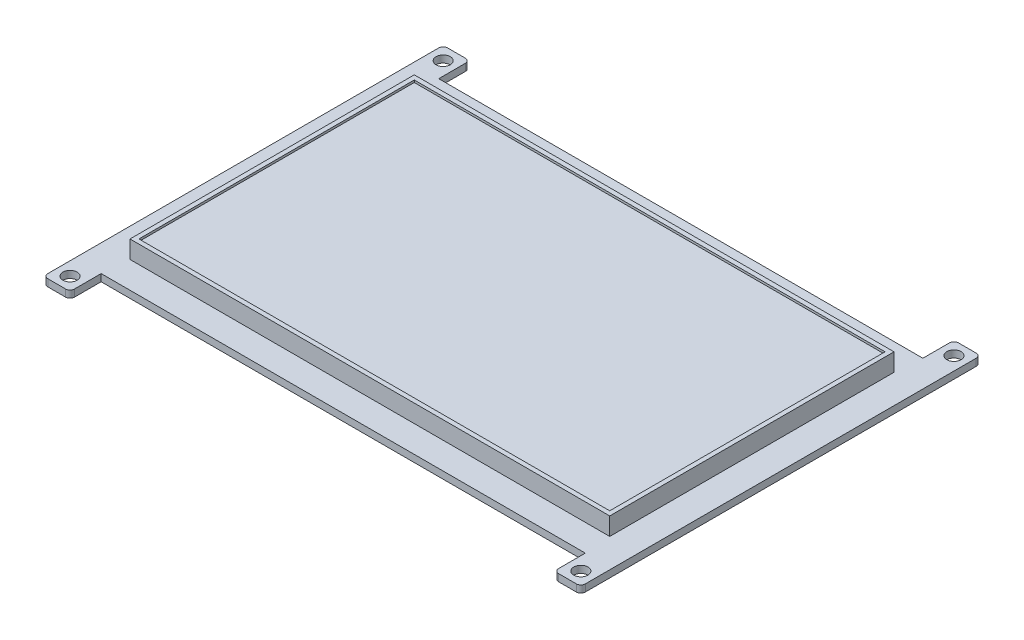
ISO-10303-21;
HEADER;
FILE_DESCRIPTION(('STEP AP214'),'2;1');
FILE_NAME('part.step','',(''),(''),'','','');
FILE_SCHEMA(('AUTOMOTIVE_DESIGN { 1 0 10303 214 1 1 1 1 }'));
ENDSEC;
DATA;
#1=APPLICATION_CONTEXT('core data for automotive mechanical design processes');
#2=APPLICATION_PROTOCOL_DEFINITION('international standard','automotive_design',2000,#1);
#3=PRODUCT_CONTEXT('',#1,'mechanical');
#4=PRODUCT('Part','Part','',(#3));
#5=PRODUCT_RELATED_PRODUCT_CATEGORY('part','',(#4));
#6=PRODUCT_DEFINITION_FORMATION('','',#4);
#7=PRODUCT_DEFINITION_CONTEXT('part definition',#1,'design');
#8=PRODUCT_DEFINITION('design','',#6,#7);
#9=PRODUCT_DEFINITION_SHAPE('','',#8);
#10=(LENGTH_UNIT() NAMED_UNIT(*) SI_UNIT(.MILLI.,.METRE.));
#11=(NAMED_UNIT(*) PLANE_ANGLE_UNIT() SI_UNIT($,.RADIAN.));
#12=(NAMED_UNIT(*) SI_UNIT($,.STERADIAN.) SOLID_ANGLE_UNIT());
#13=UNCERTAINTY_MEASURE_WITH_UNIT(LENGTH_MEASURE(1.E-05),#10,'distance_accuracy_value','');
#14=(GEOMETRIC_REPRESENTATION_CONTEXT(3) GLOBAL_UNCERTAINTY_ASSIGNED_CONTEXT((#13)) GLOBAL_UNIT_ASSIGNED_CONTEXT((#10,
#11,#12)) REPRESENTATION_CONTEXT('',''));
#15=CARTESIAN_POINT('',(0.,0.,0.));
#16=DIRECTION('',(0.,0.,1.));
#17=DIRECTION('',(1.,0.,0.));
#18=AXIS2_PLACEMENT_3D('',#15,#16,#17);
#19=CARTESIAN_POINT('',(0.,1.6,0.));
#20=DIRECTION('',(0.,1.,0.));
#21=DIRECTION('',(0.,0.,1.));
#22=AXIS2_PLACEMENT_3D('',#19,#20,#21);
#23=PLANE('',#22);
#24=CARTESIAN_POINT('',(-57.5,1.6,42.));
#25=DIRECTION('',(0.,1.,0.));
#26=DIRECTION('',(0.,0.,1.));
#27=AXIS2_PLACEMENT_3D('',#24,#25,#26);
#28=CIRCLE('',#27,1.6);
#29=CARTESIAN_POINT('',(-57.5,1.6,43.6));
#30=VERTEX_POINT('',#29);
#31=EDGE_CURVE('E288',#30,#30,#28,.F.);
#32=ORIENTED_EDGE('',*,*,#31,.T.);
#33=EDGE_LOOP('',(#32));
#34=FACE_BOUND('',#33,.T.);
#35=CARTESIAN_POINT('',(-57.5,1.6,-42.));
#36=DIRECTION('',(0.,1.,0.));
#37=DIRECTION('',(0.,0.,1.));
#38=AXIS2_PLACEMENT_3D('',#35,#36,#37);
#39=CIRCLE('',#38,1.6);
#40=CARTESIAN_POINT('',(-57.5,1.6,-40.4));
#41=VERTEX_POINT('',#40);
#42=EDGE_CURVE('E291',#41,#41,#39,.T.);
#43=ORIENTED_EDGE('',*,*,#42,.F.);
#44=EDGE_LOOP('',(#43));
#45=FACE_BOUND('',#44,.T.);
#46=CARTESIAN_POINT('',(57.5,1.6,42.));
#47=DIRECTION('',(0.,1.,0.));
#48=DIRECTION('',(0.,0.,1.));
#49=AXIS2_PLACEMENT_3D('',#46,#47,#48);
#50=CIRCLE('',#49,1.6);
#51=CARTESIAN_POINT('',(57.5,1.6,43.6));
#52=VERTEX_POINT('',#51);
#53=EDGE_CURVE('E295',#52,#52,#50,.T.);
#54=ORIENTED_EDGE('',*,*,#53,.F.);
#55=EDGE_LOOP('',(#54));
#56=FACE_BOUND('',#55,.T.);
#57=CARTESIAN_POINT('',(59.5,1.6,44.));
#58=DIRECTION('',(0.,1.,0.));
#59=DIRECTION('',(0.,0.,1.));
#60=AXIS2_PLACEMENT_3D('',#57,#58,#59);
#61=CIRCLE('',#60,0.999999999999994);
#62=CARTESIAN_POINT('',(60.5,1.6,44.));
#63=VERTEX_POINT('',#62);
#64=CARTESIAN_POINT('',(59.5,1.6,45.));
#65=VERTEX_POINT('',#64);
#66=EDGE_CURVE('E298',#63,#65,#61,.F.);
#67=ORIENTED_EDGE('',*,*,#66,.F.);
#68=DIRECTION('',(0.,0.,1.));
#69=VECTOR('',#68,1.);
#70=CARTESIAN_POINT('',(60.5,1.6,0.));
#71=LINE('',#70,#69);
#72=CARTESIAN_POINT('',(60.5,1.6,-44.));
#73=VERTEX_POINT('',#72);
#74=EDGE_CURVE('E301',#73,#63,#71,.T.);
#75=ORIENTED_EDGE('',*,*,#74,.F.);
#76=CARTESIAN_POINT('',(59.5,1.6,-44.));
#77=DIRECTION('',(0.,1.,0.));
#78=DIRECTION('',(0.,0.,1.));
#79=AXIS2_PLACEMENT_3D('',#76,#77,#78);
#80=CIRCLE('',#79,0.999999999999994);
#81=CARTESIAN_POINT('',(59.5,1.6,-45.));
#82=VERTEX_POINT('',#81);
#83=EDGE_CURVE('E304',#73,#82,#80,.T.);
#84=ORIENTED_EDGE('',*,*,#83,.T.);
#85=DIRECTION('',(1.,0.,0.));
#86=VECTOR('',#85,1.);
#87=CARTESIAN_POINT('',(0.,1.6,-45.));
#88=LINE('',#87,#86);
#89=CARTESIAN_POINT('',(55.5,1.6,-45.));
#90=VERTEX_POINT('',#89);
#91=EDGE_CURVE('E306',#90,#82,#88,.T.);
#92=ORIENTED_EDGE('',*,*,#91,.F.);
#93=CARTESIAN_POINT('',(55.5,1.6,-44.));
#94=DIRECTION('',(0.,1.,0.));
#95=DIRECTION('',(0.,0.,1.));
#96=AXIS2_PLACEMENT_3D('',#93,#94,#95);
#97=CIRCLE('',#96,0.999999999999994);
#98=CARTESIAN_POINT('',(54.5,1.6,-44.));
#99=VERTEX_POINT('',#98);
#100=EDGE_CURVE('E309',#99,#90,#97,.F.);
#101=ORIENTED_EDGE('',*,*,#100,.F.);
#102=DIRECTION('',(0.,0.,-1.));
#103=VECTOR('',#102,1.);
#104=CARTESIAN_POINT('',(54.5000000000001,1.6,-1.89084858881473E-13));
#105=LINE('',#104,#103);
#106=CARTESIAN_POINT('',(54.5,1.6,-38.));
#107=VERTEX_POINT('',#106);
#108=EDGE_CURVE('E312',#107,#99,#105,.T.);
#109=ORIENTED_EDGE('',*,*,#108,.F.);
#110=DIRECTION('',(-1.,0.,0.));
#111=VECTOR('',#110,1.);
#112=CARTESIAN_POINT('',(0.,1.6,-38.));
#113=LINE('',#112,#111);
#114=CARTESIAN_POINT('',(-54.5,1.6,-38.));
#115=VERTEX_POINT('',#114);
#116=EDGE_CURVE('E315',#107,#115,#113,.T.);
#117=ORIENTED_EDGE('',*,*,#116,.T.);
#118=DIRECTION('',(0.,0.,-1.));
#119=VECTOR('',#118,1.);
#120=CARTESIAN_POINT('',(-54.5000000000001,1.6,-1.89084858881473E-13));
#121=LINE('',#120,#119);
#122=CARTESIAN_POINT('',(-54.5,1.6,-44.));
#123=VERTEX_POINT('',#122);
#124=EDGE_CURVE('E318',#115,#123,#121,.T.);
#125=ORIENTED_EDGE('',*,*,#124,.T.);
#126=CARTESIAN_POINT('',(-55.5,1.6,-44.));
#127=DIRECTION('',(0.,1.,0.));
#128=DIRECTION('',(0.,0.,1.));
#129=AXIS2_PLACEMENT_3D('',#126,#127,#128);
#130=CIRCLE('',#129,0.999999999999994);
#131=CARTESIAN_POINT('',(-55.5,1.6,-45.));
#132=VERTEX_POINT('',#131);
#133=EDGE_CURVE('E321',#123,#132,#130,.T.);
#134=ORIENTED_EDGE('',*,*,#133,.T.);
#135=DIRECTION('',(-1.,0.,0.));
#136=VECTOR('',#135,1.);
#137=CARTESIAN_POINT('',(0.,1.6,-45.));
#138=LINE('',#137,#136);
#139=CARTESIAN_POINT('',(-59.5,1.6,-45.));
#140=VERTEX_POINT('',#139);
#141=EDGE_CURVE('E324',#132,#140,#138,.T.);
#142=ORIENTED_EDGE('',*,*,#141,.T.);
#143=CARTESIAN_POINT('',(-59.5,1.6,-44.));
#144=DIRECTION('',(0.,1.,0.));
#145=DIRECTION('',(0.,0.,1.));
#146=AXIS2_PLACEMENT_3D('',#143,#144,#145);
#147=CIRCLE('',#146,0.999999999999994);
#148=CARTESIAN_POINT('',(-60.5,1.6,-44.));
#149=VERTEX_POINT('',#148);
#150=EDGE_CURVE('E326',#149,#140,#147,.F.);
#151=ORIENTED_EDGE('',*,*,#150,.F.);
#152=DIRECTION('',(0.,0.,1.));
#153=VECTOR('',#152,1.);
#154=CARTESIAN_POINT('',(-60.5,1.6,0.));
#155=LINE('',#154,#153);
#156=CARTESIAN_POINT('',(-60.5,1.6,44.));
#157=VERTEX_POINT('',#156);
#158=EDGE_CURVE('E329',#149,#157,#155,.T.);
#159=ORIENTED_EDGE('',*,*,#158,.T.);
#160=CARTESIAN_POINT('',(-59.5,1.6,44.));
#161=DIRECTION('',(0.,1.,0.));
#162=DIRECTION('',(0.,0.,1.));
#163=AXIS2_PLACEMENT_3D('',#160,#161,#162);
#164=CIRCLE('',#163,0.999999999999994);
#165=CARTESIAN_POINT('',(-59.5,1.6,45.));
#166=VERTEX_POINT('',#165);
#167=EDGE_CURVE('E332',#157,#166,#164,.T.);
#168=ORIENTED_EDGE('',*,*,#167,.T.);
#169=DIRECTION('',(-1.,0.,0.));
#170=VECTOR('',#169,1.);
#171=CARTESIAN_POINT('',(0.,1.6,45.));
#172=LINE('',#171,#170);
#173=CARTESIAN_POINT('',(-55.5,1.6,45.));
#174=VERTEX_POINT('',#173);
#175=EDGE_CURVE('E334',#174,#166,#172,.T.);
#176=ORIENTED_EDGE('',*,*,#175,.F.);
#177=CARTESIAN_POINT('',(-55.5,1.6,44.));
#178=DIRECTION('',(0.,1.,0.));
#179=DIRECTION('',(0.,0.,1.));
#180=AXIS2_PLACEMENT_3D('',#177,#178,#179);
#181=CIRCLE('',#180,0.999999999999994);
#182=CARTESIAN_POINT('',(-54.5,1.6,44.));
#183=VERTEX_POINT('',#182);
#184=EDGE_CURVE('E337',#183,#174,#181,.F.);
#185=ORIENTED_EDGE('',*,*,#184,.F.);
#186=DIRECTION('',(0.,0.,1.));
#187=VECTOR('',#186,1.);
#188=CARTESIAN_POINT('',(-54.5000000000001,1.6,1.89084858881473E-13));
#189=LINE('',#188,#187);
#190=CARTESIAN_POINT('',(-54.5,1.6,38.));
#191=VERTEX_POINT('',#190);
#192=EDGE_CURVE('E340',#191,#183,#189,.T.);
#193=ORIENTED_EDGE('',*,*,#192,.F.);
#194=DIRECTION('',(-1.,0.,0.));
#195=VECTOR('',#194,1.);
#196=CARTESIAN_POINT('',(0.,1.6,38.));
#197=LINE('',#196,#195);
#198=CARTESIAN_POINT('',(54.5,1.6,38.));
#199=VERTEX_POINT('',#198);
#200=EDGE_CURVE('E343',#199,#191,#197,.T.);
#201=ORIENTED_EDGE('',*,*,#200,.F.);
#202=DIRECTION('',(0.,0.,1.));
#203=VECTOR('',#202,1.);
#204=CARTESIAN_POINT('',(54.5000000000001,1.6,1.89084858881473E-13));
#205=LINE('',#204,#203);
#206=CARTESIAN_POINT('',(54.5,1.6,44.));
#207=VERTEX_POINT('',#206);
#208=EDGE_CURVE('E346',#199,#207,#205,.T.);
#209=ORIENTED_EDGE('',*,*,#208,.T.);
#210=CARTESIAN_POINT('',(55.5,1.6,44.));
#211=DIRECTION('',(0.,1.,0.));
#212=DIRECTION('',(0.,0.,1.));
#213=AXIS2_PLACEMENT_3D('',#210,#211,#212);
#214=CIRCLE('',#213,0.999999999999994);
#215=CARTESIAN_POINT('',(55.5,1.6,45.));
#216=VERTEX_POINT('',#215);
#217=EDGE_CURVE('E349',#207,#216,#214,.T.);
#218=ORIENTED_EDGE('',*,*,#217,.T.);
#219=DIRECTION('',(1.,0.,0.));
#220=VECTOR('',#219,1.);
#221=CARTESIAN_POINT('',(0.,1.6,45.));
#222=LINE('',#221,#220);
#223=EDGE_CURVE('E352',#216,#65,#222,.T.);
#224=ORIENTED_EDGE('',*,*,#223,.T.);
#225=EDGE_LOOP('',(#67,#75,#84,#92,#101,#109,#117,#125,#134,#142,#151,#159,#168,#176,#185,#193,
#201,#209,#218,#224));
#226=FACE_BOUND('',#225,.T.);
#227=CARTESIAN_POINT('',(57.5,1.6,-42.));
#228=DIRECTION('',(0.,1.,0.));
#229=DIRECTION('',(0.,0.,1.));
#230=AXIS2_PLACEMENT_3D('',#227,#228,#229);
#231=CIRCLE('',#230,1.6);
#232=CARTESIAN_POINT('',(57.5,1.6,-40.4));
#233=VERTEX_POINT('',#232);
#234=EDGE_CURVE('E354',#233,#233,#231,.F.);
#235=ORIENTED_EDGE('',*,*,#234,.T.);
#236=EDGE_LOOP('',(#235));
#237=FACE_BOUND('',#236,.T.);
#238=DIRECTION('',(-1.,0.,0.));
#239=VECTOR('',#238,1.);
#240=CARTESIAN_POINT('',(-54.,1.6,-32.));
#241=LINE('',#240,#239);
#242=CARTESIAN_POINT('',(54.,1.6,-32.));
#243=VERTEX_POINT('',#242);
#244=CARTESIAN_POINT('',(-54.,1.6,-32.));
#245=VERTEX_POINT('',#244);
#246=EDGE_CURVE('E274',#243,#245,#241,.T.);
#247=ORIENTED_EDGE('',*,*,#246,.F.);
#248=DIRECTION('',(0.,0.,-1.));
#249=VECTOR('',#248,1.);
#250=CARTESIAN_POINT('',(54.,1.6,-32.));
#251=LINE('',#250,#249);
#252=CARTESIAN_POINT('',(54.,1.6,32.));
#253=VERTEX_POINT('',#252);
#254=EDGE_CURVE('E257',#253,#243,#251,.T.);
#255=ORIENTED_EDGE('',*,*,#254,.F.);
#256=DIRECTION('',(1.,0.,0.));
#257=VECTOR('',#256,1.);
#258=CARTESIAN_POINT('',(-54.,1.6,32.));
#259=LINE('',#258,#257);
#260=CARTESIAN_POINT('',(-54.,1.6,32.));
#261=VERTEX_POINT('',#260);
#262=EDGE_CURVE('E265',#261,#253,#259,.T.);
#263=ORIENTED_EDGE('',*,*,#262,.F.);
#264=DIRECTION('',(0.,0.,1.));
#265=VECTOR('',#264,1.);
#266=CARTESIAN_POINT('',(-54.,1.6,-32.));
#267=LINE('',#266,#265);
#268=EDGE_CURVE('E276',#245,#261,#267,.T.);
#269=ORIENTED_EDGE('',*,*,#268,.F.);
#270=EDGE_LOOP('',(#247,#255,#263,#269));
#271=FACE_BOUND('',#270,.T.);
#272=ADVANCED_FACE('F37',(#34,#45,#56,#226,#237,#271),#23,.T.);
#273=CARTESIAN_POINT('',(59.5,1.6,44.));
#274=DIRECTION('',(0.,-1.,0.));
#275=DIRECTION('',(0.,0.,-1.));
#276=AXIS2_PLACEMENT_3D('',#273,#274,#275);
#277=CYLINDRICAL_SURFACE('',#276,0.999999999999994);
#278=CARTESIAN_POINT('',(59.5,0.,44.));
#279=DIRECTION('',(0.,1.,0.));
#280=DIRECTION('',(0.,0.,1.));
#281=AXIS2_PLACEMENT_3D('',#278,#279,#280);
#282=CIRCLE('',#281,0.999999999999994);
#283=CARTESIAN_POINT('',(60.5,0.,44.));
#284=VERTEX_POINT('',#283);
#285=CARTESIAN_POINT('',(59.5,0.,45.));
#286=VERTEX_POINT('',#285);
#287=EDGE_CURVE('E366',#284,#286,#282,.F.);
#288=ORIENTED_EDGE('',*,*,#287,.F.);
#289=DIRECTION('',(0.,-1.,0.));
#290=VECTOR('',#289,1.);
#291=CARTESIAN_POINT('',(60.5,1.6,44.));
#292=LINE('',#291,#290);
#293=EDGE_CURVE('E11',#63,#284,#292,.T.);
#294=ORIENTED_EDGE('',*,*,#293,.F.);
#295=ORIENTED_EDGE('',*,*,#66,.T.);
#296=DIRECTION('',(0.,-1.,0.));
#297=VECTOR('',#296,1.);
#298=CARTESIAN_POINT('',(59.5,1.6,45.));
#299=LINE('',#298,#297);
#300=EDGE_CURVE('E357',#65,#286,#299,.T.);
#301=ORIENTED_EDGE('',*,*,#300,.T.);
#302=EDGE_LOOP('',(#288,#294,#295,#301));
#303=FACE_BOUND('',#302,.T.);
#304=ADVANCED_FACE('F484',(#303),#277,.T.);
#305=CARTESIAN_POINT('',(60.5,1.6,0.));
#306=DIRECTION('',(1.,0.,0.));
#307=DIRECTION('',(0.,0.,-1.));
#308=AXIS2_PLACEMENT_3D('',#305,#306,#307);
#309=PLANE('',#308);
#310=DIRECTION('',(0.,0.,1.));
#311=VECTOR('',#310,1.);
#312=CARTESIAN_POINT('',(60.5,0.,0.));
#313=LINE('',#312,#311);
#314=CARTESIAN_POINT('',(60.5,0.,-44.));
#315=VERTEX_POINT('',#314);
#316=EDGE_CURVE('E369',#315,#284,#313,.T.);
#317=ORIENTED_EDGE('',*,*,#316,.F.);
#318=DIRECTION('',(0.,-1.,0.));
#319=VECTOR('',#318,1.);
#320=CARTESIAN_POINT('',(60.5,1.6,-44.));
#321=LINE('',#320,#319);
#322=EDGE_CURVE('E45',#73,#315,#321,.T.);
#323=ORIENTED_EDGE('',*,*,#322,.F.);
#324=ORIENTED_EDGE('',*,*,#74,.T.);
#325=ORIENTED_EDGE('',*,*,#293,.T.);
#326=EDGE_LOOP('',(#317,#323,#324,#325));
#327=FACE_BOUND('',#326,.T.);
#328=ADVANCED_FACE('F480',(#327),#309,.T.);
#329=CARTESIAN_POINT('',(59.5,1.6,-44.));
#330=DIRECTION('',(0.,-1.,0.));
#331=DIRECTION('',(0.,0.,-1.));
#332=AXIS2_PLACEMENT_3D('',#329,#330,#331);
#333=CYLINDRICAL_SURFACE('',#332,0.999999999999994);
#334=CARTESIAN_POINT('',(59.5,0.,-44.));
#335=DIRECTION('',(0.,1.,0.));
#336=DIRECTION('',(0.,0.,1.));
#337=AXIS2_PLACEMENT_3D('',#334,#335,#336);
#338=CIRCLE('',#337,0.999999999999994);
#339=CARTESIAN_POINT('',(59.5,0.,-45.));
#340=VERTEX_POINT('',#339);
#341=EDGE_CURVE('E372',#315,#340,#338,.T.);
#342=ORIENTED_EDGE('',*,*,#341,.T.);
#343=DIRECTION('',(0.,-1.,0.));
#344=VECTOR('',#343,1.);
#345=CARTESIAN_POINT('',(59.5,1.6,-45.));
#346=LINE('',#345,#344);
#347=EDGE_CURVE('E467',#82,#340,#346,.T.);
#348=ORIENTED_EDGE('',*,*,#347,.F.);
#349=ORIENTED_EDGE('',*,*,#83,.F.);
#350=ORIENTED_EDGE('',*,*,#322,.T.);
#351=EDGE_LOOP('',(#342,#348,#349,#350));
#352=FACE_BOUND('',#351,.T.);
#353=ADVANCED_FACE('F471',(#352),#333,.T.);
#354=CARTESIAN_POINT('',(0.,1.6,-45.));
#355=DIRECTION('',(0.,0.,-1.));
#356=DIRECTION('',(-1.,0.,0.));
#357=AXIS2_PLACEMENT_3D('',#354,#355,#356);
#358=PLANE('',#357);
#359=DIRECTION('',(1.,0.,0.));
#360=VECTOR('',#359,1.);
#361=CARTESIAN_POINT('',(0.,0.,-45.));
#362=LINE('',#361,#360);
#363=CARTESIAN_POINT('',(55.5,0.,-45.));
#364=VERTEX_POINT('',#363);
#365=EDGE_CURVE('E375',#364,#340,#362,.T.);
#366=ORIENTED_EDGE('',*,*,#365,.F.);
#367=DIRECTION('',(0.,-1.,0.));
#368=VECTOR('',#367,1.);
#369=CARTESIAN_POINT('',(55.5,1.6,-45.));
#370=LINE('',#369,#368);
#371=EDGE_CURVE('E465',#90,#364,#370,.T.);
#372=ORIENTED_EDGE('',*,*,#371,.F.);
#373=ORIENTED_EDGE('',*,*,#91,.T.);
#374=ORIENTED_EDGE('',*,*,#347,.T.);
#375=EDGE_LOOP('',(#366,#372,#373,#374));
#376=FACE_BOUND('',#375,.T.);
#377=ADVANCED_FACE('F547',(#376),#358,.T.);
#378=CARTESIAN_POINT('',(55.5,1.6,-44.));
#379=DIRECTION('',(0.,-1.,0.));
#380=DIRECTION('',(0.,0.,-1.));
#381=AXIS2_PLACEMENT_3D('',#378,#379,#380);
#382=CYLINDRICAL_SURFACE('',#381,0.999999999999994);
#383=CARTESIAN_POINT('',(55.5,0.,-44.));
#384=DIRECTION('',(0.,1.,0.));
#385=DIRECTION('',(0.,0.,1.));
#386=AXIS2_PLACEMENT_3D('',#383,#384,#385);
#387=CIRCLE('',#386,0.999999999999994);
#388=CARTESIAN_POINT('',(54.5,0.,-44.));
#389=VERTEX_POINT('',#388);
#390=EDGE_CURVE('E378',#389,#364,#387,.F.);
#391=ORIENTED_EDGE('',*,*,#390,.F.);
#392=DIRECTION('',(0.,-1.,0.));
#393=VECTOR('',#392,1.);
#394=CARTESIAN_POINT('',(54.5,1.6,-44.));
#395=LINE('',#394,#393);
#396=EDGE_CURVE('E463',#99,#389,#395,.T.);
#397=ORIENTED_EDGE('',*,*,#396,.F.);
#398=ORIENTED_EDGE('',*,*,#100,.T.);
#399=ORIENTED_EDGE('',*,*,#371,.T.);
#400=EDGE_LOOP('',(#391,#397,#398,#399));
#401=FACE_BOUND('',#400,.T.);
#402=ADVANCED_FACE('F544',(#401),#382,.T.);
#403=CARTESIAN_POINT('',(54.5000000000001,1.6,-1.89084858881473E-13));
#404=DIRECTION('',(-1.,0.,0.));
#405=DIRECTION('',(0.,0.,1.));
#406=AXIS2_PLACEMENT_3D('',#403,#404,#405);
#407=PLANE('',#406);
#408=DIRECTION('',(0.,0.,-1.));
#409=VECTOR('',#408,1.);
#410=CARTESIAN_POINT('',(54.5000000000001,0.,-1.89084858881473E-13));
#411=LINE('',#410,#409);
#412=CARTESIAN_POINT('',(54.5,0.,-38.));
#413=VERTEX_POINT('',#412);
#414=EDGE_CURVE('E381',#413,#389,#411,.T.);
#415=ORIENTED_EDGE('',*,*,#414,.F.);
#416=DIRECTION('',(0.,-1.,0.));
#417=VECTOR('',#416,1.);
#418=CARTESIAN_POINT('',(54.5,1.6,-38.));
#419=LINE('',#418,#417);
#420=EDGE_CURVE('E461',#107,#413,#419,.T.);
#421=ORIENTED_EDGE('',*,*,#420,.F.);
#422=ORIENTED_EDGE('',*,*,#108,.T.);
#423=ORIENTED_EDGE('',*,*,#396,.T.);
#424=EDGE_LOOP('',(#415,#421,#422,#423));
#425=FACE_BOUND('',#424,.T.);
#426=ADVANCED_FACE('F539',(#425),#407,.T.);
#427=CARTESIAN_POINT('',(0.,1.6,-38.));
#428=DIRECTION('',(0.,0.,1.));
#429=DIRECTION('',(1.,0.,0.));
#430=AXIS2_PLACEMENT_3D('',#427,#428,#429);
#431=PLANE('',#430);
#432=DIRECTION('',(-1.,0.,0.));
#433=VECTOR('',#432,1.);
#434=CARTESIAN_POINT('',(0.,0.,-38.));
#435=LINE('',#434,#433);
#436=CARTESIAN_POINT('',(-54.5,0.,-38.));
#437=VERTEX_POINT('',#436);
#438=EDGE_CURVE('E384',#413,#437,#435,.T.);
#439=ORIENTED_EDGE('',*,*,#438,.T.);
#440=DIRECTION('',(0.,-1.,0.));
#441=VECTOR('',#440,1.);
#442=CARTESIAN_POINT('',(-54.5,1.6,-38.));
#443=LINE('',#442,#441);
#444=EDGE_CURVE('E458',#115,#437,#443,.T.);
#445=ORIENTED_EDGE('',*,*,#444,.F.);
#446=ORIENTED_EDGE('',*,*,#116,.F.);
#447=ORIENTED_EDGE('',*,*,#420,.T.);
#448=EDGE_LOOP('',(#439,#445,#446,#447));
#449=FACE_BOUND('',#448,.T.);
#450=ADVANCED_FACE('F536',(#449),#431,.F.);
#451=CARTESIAN_POINT('',(-54.5000000000001,1.6,-1.89084858881473E-13));
#452=DIRECTION('',(-1.,0.,0.));
#453=DIRECTION('',(0.,0.,1.));
#454=AXIS2_PLACEMENT_3D('',#451,#452,#453);
#455=PLANE('',#454);
#456=DIRECTION('',(0.,0.,-1.));
#457=VECTOR('',#456,1.);
#458=CARTESIAN_POINT('',(-54.5000000000001,0.,-1.89084858881473E-13));
#459=LINE('',#458,#457);
#460=CARTESIAN_POINT('',(-54.5,0.,-44.));
#461=VERTEX_POINT('',#460);
#462=EDGE_CURVE('E387',#437,#461,#459,.T.);
#463=ORIENTED_EDGE('',*,*,#462,.T.);
#464=DIRECTION('',(0.,-1.,0.));
#465=VECTOR('',#464,1.);
#466=CARTESIAN_POINT('',(-54.5,1.6,-44.));
#467=LINE('',#466,#465);
#468=EDGE_CURVE('E455',#123,#461,#467,.T.);
#469=ORIENTED_EDGE('',*,*,#468,.F.);
#470=ORIENTED_EDGE('',*,*,#124,.F.);
#471=ORIENTED_EDGE('',*,*,#444,.T.);
#472=EDGE_LOOP('',(#463,#469,#470,#471));
#473=FACE_BOUND('',#472,.T.);
#474=ADVANCED_FACE('F532',(#473),#455,.F.);
#475=CARTESIAN_POINT('',(-55.5,1.6,-44.));
#476=DIRECTION('',(0.,-1.,0.));
#477=DIRECTION('',(0.,0.,-1.));
#478=AXIS2_PLACEMENT_3D('',#475,#476,#477);
#479=CYLINDRICAL_SURFACE('',#478,0.999999999999994);
#480=CARTESIAN_POINT('',(-55.5,0.,-44.));
#481=DIRECTION('',(0.,1.,0.));
#482=DIRECTION('',(0.,0.,1.));
#483=AXIS2_PLACEMENT_3D('',#480,#481,#482);
#484=CIRCLE('',#483,0.999999999999994);
#485=CARTESIAN_POINT('',(-55.5,0.,-45.));
#486=VERTEX_POINT('',#485);
#487=EDGE_CURVE('E390',#461,#486,#484,.T.);
#488=ORIENTED_EDGE('',*,*,#487,.T.);
#489=DIRECTION('',(0.,-1.,0.));
#490=VECTOR('',#489,1.);
#491=CARTESIAN_POINT('',(-55.5,1.6,-45.));
#492=LINE('',#491,#490);
#493=EDGE_CURVE('E452',#132,#486,#492,.T.);
#494=ORIENTED_EDGE('',*,*,#493,.F.);
#495=ORIENTED_EDGE('',*,*,#133,.F.);
#496=ORIENTED_EDGE('',*,*,#468,.T.);
#497=EDGE_LOOP('',(#488,#494,#495,#496));
#498=FACE_BOUND('',#497,.T.);
#499=ADVANCED_FACE('F530',(#498),#479,.T.);
#500=CARTESIAN_POINT('',(0.,1.6,-45.));
#501=DIRECTION('',(0.,0.,1.));
#502=DIRECTION('',(1.,0.,0.));
#503=AXIS2_PLACEMENT_3D('',#500,#501,#502);
#504=PLANE('',#503);
#505=DIRECTION('',(-1.,0.,0.));
#506=VECTOR('',#505,1.);
#507=CARTESIAN_POINT('',(0.,0.,-45.));
#508=LINE('',#507,#506);
#509=CARTESIAN_POINT('',(-59.5,0.,-45.));
#510=VERTEX_POINT('',#509);
#511=EDGE_CURVE('E393',#486,#510,#508,.T.);
#512=ORIENTED_EDGE('',*,*,#511,.T.);
#513=DIRECTION('',(0.,-1.,0.));
#514=VECTOR('',#513,1.);
#515=CARTESIAN_POINT('',(-59.5,1.6,-45.));
#516=LINE('',#515,#514);
#517=EDGE_CURVE('E450',#140,#510,#516,.T.);
#518=ORIENTED_EDGE('',*,*,#517,.F.);
#519=ORIENTED_EDGE('',*,*,#141,.F.);
#520=ORIENTED_EDGE('',*,*,#493,.T.);
#521=EDGE_LOOP('',(#512,#518,#519,#520));
#522=FACE_BOUND('',#521,.T.);
#523=ADVANCED_FACE('F525',(#522),#504,.F.);
#524=CARTESIAN_POINT('',(-59.5,1.6,-44.));
#525=DIRECTION('',(0.,-1.,0.));
#526=DIRECTION('',(0.,0.,-1.));
#527=AXIS2_PLACEMENT_3D('',#524,#525,#526);
#528=CYLINDRICAL_SURFACE('',#527,0.999999999999994);
#529=CARTESIAN_POINT('',(-59.5,0.,-44.));
#530=DIRECTION('',(0.,1.,0.));
#531=DIRECTION('',(0.,0.,1.));
#532=AXIS2_PLACEMENT_3D('',#529,#530,#531);
#533=CIRCLE('',#532,0.999999999999994);
#534=CARTESIAN_POINT('',(-60.5,0.,-44.));
#535=VERTEX_POINT('',#534);
#536=EDGE_CURVE('E396',#535,#510,#533,.F.);
#537=ORIENTED_EDGE('',*,*,#536,.F.);
#538=DIRECTION('',(0.,-1.,0.));
#539=VECTOR('',#538,1.);
#540=CARTESIAN_POINT('',(-60.5,1.6,-44.));
#541=LINE('',#540,#539);
#542=EDGE_CURVE('E448',#149,#535,#541,.T.);
#543=ORIENTED_EDGE('',*,*,#542,.F.);
#544=ORIENTED_EDGE('',*,*,#150,.T.);
#545=ORIENTED_EDGE('',*,*,#517,.T.);
#546=EDGE_LOOP('',(#537,#543,#544,#545));
#547=FACE_BOUND('',#546,.T.);
#548=ADVANCED_FACE('F520',(#547),#528,.T.);
#549=CARTESIAN_POINT('',(-60.5,1.6,0.));
#550=DIRECTION('',(1.,0.,0.));
#551=DIRECTION('',(0.,0.,-1.));
#552=AXIS2_PLACEMENT_3D('',#549,#550,#551);
#553=PLANE('',#552);
#554=DIRECTION('',(0.,0.,1.));
#555=VECTOR('',#554,1.);
#556=CARTESIAN_POINT('',(-60.5,0.,0.));
#557=LINE('',#556,#555);
#558=CARTESIAN_POINT('',(-60.5,0.,44.));
#559=VERTEX_POINT('',#558);
#560=EDGE_CURVE('E399',#535,#559,#557,.T.);
#561=ORIENTED_EDGE('',*,*,#560,.T.);
#562=DIRECTION('',(0.,-1.,0.));
#563=VECTOR('',#562,1.);
#564=CARTESIAN_POINT('',(-60.5,1.6,44.));
#565=LINE('',#564,#563);
#566=EDGE_CURVE('E445',#157,#559,#565,.T.);
#567=ORIENTED_EDGE('',*,*,#566,.F.);
#568=ORIENTED_EDGE('',*,*,#158,.F.);
#569=ORIENTED_EDGE('',*,*,#542,.T.);
#570=EDGE_LOOP('',(#561,#567,#568,#569));
#571=FACE_BOUND('',#570,.T.);
#572=ADVANCED_FACE('F550',(#571),#553,.F.);
#573=CARTESIAN_POINT('',(-59.5,1.6,44.));
#574=DIRECTION('',(0.,-1.,0.));
#575=DIRECTION('',(0.,0.,-1.));
#576=AXIS2_PLACEMENT_3D('',#573,#574,#575);
#577=CYLINDRICAL_SURFACE('',#576,0.999999999999994);
#578=CARTESIAN_POINT('',(-59.5,0.,44.));
#579=DIRECTION('',(0.,1.,0.));
#580=DIRECTION('',(0.,0.,1.));
#581=AXIS2_PLACEMENT_3D('',#578,#579,#580);
#582=CIRCLE('',#581,0.999999999999994);
#583=CARTESIAN_POINT('',(-59.5,0.,45.));
#584=VERTEX_POINT('',#583);
#585=EDGE_CURVE('E402',#559,#584,#582,.T.);
#586=ORIENTED_EDGE('',*,*,#585,.T.);
#587=DIRECTION('',(0.,-1.,0.));
#588=VECTOR('',#587,1.);
#589=CARTESIAN_POINT('',(-59.5,1.6,45.));
#590=LINE('',#589,#588);
#591=EDGE_CURVE('E443',#166,#584,#590,.T.);
#592=ORIENTED_EDGE('',*,*,#591,.F.);
#593=ORIENTED_EDGE('',*,*,#167,.F.);
#594=ORIENTED_EDGE('',*,*,#566,.T.);
#595=EDGE_LOOP('',(#586,#592,#593,#594));
#596=FACE_BOUND('',#595,.T.);
#597=ADVANCED_FACE('F514',(#596),#577,.T.);
#598=CARTESIAN_POINT('',(0.,1.6,45.));
#599=DIRECTION('',(0.,0.,1.));
#600=DIRECTION('',(1.,0.,0.));
#601=AXIS2_PLACEMENT_3D('',#598,#599,#600);
#602=PLANE('',#601);
#603=DIRECTION('',(-1.,0.,0.));
#604=VECTOR('',#603,1.);
#605=CARTESIAN_POINT('',(0.,0.,45.));
#606=LINE('',#605,#604);
#607=CARTESIAN_POINT('',(-55.5,0.,45.));
#608=VERTEX_POINT('',#607);
#609=EDGE_CURVE('E405',#608,#584,#606,.T.);
#610=ORIENTED_EDGE('',*,*,#609,.F.);
#611=DIRECTION('',(0.,-1.,0.));
#612=VECTOR('',#611,1.);
#613=CARTESIAN_POINT('',(-55.5,1.6,45.));
#614=LINE('',#613,#612);
#615=EDGE_CURVE('E441',#174,#608,#614,.T.);
#616=ORIENTED_EDGE('',*,*,#615,.F.);
#617=ORIENTED_EDGE('',*,*,#175,.T.);
#618=ORIENTED_EDGE('',*,*,#591,.T.);
#619=EDGE_LOOP('',(#610,#616,#617,#618));
#620=FACE_BOUND('',#619,.T.);
#621=ADVANCED_FACE('F511',(#620),#602,.T.);
#622=CARTESIAN_POINT('',(-55.5,1.6,44.));
#623=DIRECTION('',(0.,-1.,0.));
#624=DIRECTION('',(0.,0.,-1.));
#625=AXIS2_PLACEMENT_3D('',#622,#623,#624);
#626=CYLINDRICAL_SURFACE('',#625,0.999999999999994);
#627=CARTESIAN_POINT('',(-55.5,0.,44.));
#628=DIRECTION('',(0.,1.,0.));
#629=DIRECTION('',(0.,0.,1.));
#630=AXIS2_PLACEMENT_3D('',#627,#628,#629);
#631=CIRCLE('',#630,0.999999999999994);
#632=CARTESIAN_POINT('',(-54.5,0.,44.));
#633=VERTEX_POINT('',#632);
#634=EDGE_CURVE('E408',#633,#608,#631,.F.);
#635=ORIENTED_EDGE('',*,*,#634,.F.);
#636=DIRECTION('',(0.,-1.,0.));
#637=VECTOR('',#636,1.);
#638=CARTESIAN_POINT('',(-54.5,1.6,44.));
#639=LINE('',#638,#637);
#640=EDGE_CURVE('E439',#183,#633,#639,.T.);
#641=ORIENTED_EDGE('',*,*,#640,.F.);
#642=ORIENTED_EDGE('',*,*,#184,.T.);
#643=ORIENTED_EDGE('',*,*,#615,.T.);
#644=EDGE_LOOP('',(#635,#641,#642,#643));
#645=FACE_BOUND('',#644,.T.);
#646=ADVANCED_FACE('F507',(#645),#626,.T.);
#647=CARTESIAN_POINT('',(-54.5000000000001,1.6,1.89084858881473E-13));
#648=DIRECTION('',(1.,0.,0.));
#649=DIRECTION('',(0.,0.,-1.));
#650=AXIS2_PLACEMENT_3D('',#647,#648,#649);
#651=PLANE('',#650);
#652=DIRECTION('',(0.,0.,1.));
#653=VECTOR('',#652,1.);
#654=CARTESIAN_POINT('',(-54.5000000000001,0.,1.89084858881473E-13));
#655=LINE('',#654,#653);
#656=CARTESIAN_POINT('',(-54.5,0.,38.));
#657=VERTEX_POINT('',#656);
#658=EDGE_CURVE('E411',#657,#633,#655,.T.);
#659=ORIENTED_EDGE('',*,*,#658,.F.);
#660=DIRECTION('',(0.,-1.,0.));
#661=VECTOR('',#660,1.);
#662=CARTESIAN_POINT('',(-54.5,1.6,38.));
#663=LINE('',#662,#661);
#664=EDGE_CURVE('E437',#191,#657,#663,.T.);
#665=ORIENTED_EDGE('',*,*,#664,.F.);
#666=ORIENTED_EDGE('',*,*,#192,.T.);
#667=ORIENTED_EDGE('',*,*,#640,.T.);
#668=EDGE_LOOP('',(#659,#665,#666,#667));
#669=FACE_BOUND('',#668,.T.);
#670=ADVANCED_FACE('F503',(#669),#651,.T.);
#671=CARTESIAN_POINT('',(0.,1.6,38.));
#672=DIRECTION('',(0.,0.,1.));
#673=DIRECTION('',(1.,0.,0.));
#674=AXIS2_PLACEMENT_3D('',#671,#672,#673);
#675=PLANE('',#674);
#676=DIRECTION('',(-1.,0.,0.));
#677=VECTOR('',#676,1.);
#678=CARTESIAN_POINT('',(0.,0.,38.));
#679=LINE('',#678,#677);
#680=CARTESIAN_POINT('',(54.5,0.,38.));
#681=VERTEX_POINT('',#680);
#682=EDGE_CURVE('E414',#681,#657,#679,.T.);
#683=ORIENTED_EDGE('',*,*,#682,.F.);
#684=DIRECTION('',(0.,-1.,0.));
#685=VECTOR('',#684,1.);
#686=CARTESIAN_POINT('',(54.5,1.6,38.));
#687=LINE('',#686,#685);
#688=EDGE_CURVE('E435',#199,#681,#687,.T.);
#689=ORIENTED_EDGE('',*,*,#688,.F.);
#690=ORIENTED_EDGE('',*,*,#200,.T.);
#691=ORIENTED_EDGE('',*,*,#664,.T.);
#692=EDGE_LOOP('',(#683,#689,#690,#691));
#693=FACE_BOUND('',#692,.T.);
#694=ADVANCED_FACE('F498',(#693),#675,.T.);
#695=CARTESIAN_POINT('',(54.5000000000001,1.6,1.89084858881473E-13));
#696=DIRECTION('',(1.,0.,0.));
#697=DIRECTION('',(0.,0.,-1.));
#698=AXIS2_PLACEMENT_3D('',#695,#696,#697);
#699=PLANE('',#698);
#700=DIRECTION('',(0.,0.,1.));
#701=VECTOR('',#700,1.);
#702=CARTESIAN_POINT('',(54.5000000000001,0.,1.89084858881473E-13));
#703=LINE('',#702,#701);
#704=CARTESIAN_POINT('',(54.5,0.,44.));
#705=VERTEX_POINT('',#704);
#706=EDGE_CURVE('E417',#681,#705,#703,.T.);
#707=ORIENTED_EDGE('',*,*,#706,.T.);
#708=DIRECTION('',(0.,-1.,0.));
#709=VECTOR('',#708,1.);
#710=CARTESIAN_POINT('',(54.5,1.6,44.));
#711=LINE('',#710,#709);
#712=EDGE_CURVE('E432',#207,#705,#711,.T.);
#713=ORIENTED_EDGE('',*,*,#712,.F.);
#714=ORIENTED_EDGE('',*,*,#208,.F.);
#715=ORIENTED_EDGE('',*,*,#688,.T.);
#716=EDGE_LOOP('',(#707,#713,#714,#715));
#717=FACE_BOUND('',#716,.T.);
#718=ADVANCED_FACE('F495',(#717),#699,.F.);
#719=CARTESIAN_POINT('',(55.5,1.6,44.));
#720=DIRECTION('',(0.,-1.,0.));
#721=DIRECTION('',(0.,0.,-1.));
#722=AXIS2_PLACEMENT_3D('',#719,#720,#721);
#723=CYLINDRICAL_SURFACE('',#722,0.999999999999994);
#724=CARTESIAN_POINT('',(55.5,0.,44.));
#725=DIRECTION('',(0.,1.,0.));
#726=DIRECTION('',(0.,0.,1.));
#727=AXIS2_PLACEMENT_3D('',#724,#725,#726);
#728=CIRCLE('',#727,0.999999999999994);
#729=CARTESIAN_POINT('',(55.5,0.,45.));
#730=VERTEX_POINT('',#729);
#731=EDGE_CURVE('E420',#705,#730,#728,.T.);
#732=ORIENTED_EDGE('',*,*,#731,.T.);
#733=DIRECTION('',(0.,-1.,0.));
#734=VECTOR('',#733,1.);
#735=CARTESIAN_POINT('',(55.5,1.6,45.));
#736=LINE('',#735,#734);
#737=EDGE_CURVE('E429',#216,#730,#736,.T.);
#738=ORIENTED_EDGE('',*,*,#737,.F.);
#739=ORIENTED_EDGE('',*,*,#217,.F.);
#740=ORIENTED_EDGE('',*,*,#712,.T.);
#741=EDGE_LOOP('',(#732,#738,#739,#740));
#742=FACE_BOUND('',#741,.T.);
#743=ADVANCED_FACE('F491',(#742),#723,.T.);
#744=CARTESIAN_POINT('',(0.,1.6,45.));
#745=DIRECTION('',(0.,0.,-1.));
#746=DIRECTION('',(-1.,0.,0.));
#747=AXIS2_PLACEMENT_3D('',#744,#745,#746);
#748=PLANE('',#747);
#749=DIRECTION('',(1.,0.,0.));
#750=VECTOR('',#749,1.);
#751=CARTESIAN_POINT('',(0.,0.,45.));
#752=LINE('',#751,#750);
#753=EDGE_CURVE('E423',#730,#286,#752,.T.);
#754=ORIENTED_EDGE('',*,*,#753,.T.);
#755=ORIENTED_EDGE('',*,*,#300,.F.);
#756=ORIENTED_EDGE('',*,*,#223,.F.);
#757=ORIENTED_EDGE('',*,*,#737,.T.);
#758=EDGE_LOOP('',(#754,#755,#756,#757));
#759=FACE_BOUND('',#758,.T.);
#760=ADVANCED_FACE('F489',(#759),#748,.F.);
#761=CARTESIAN_POINT('',(57.5,1.6,42.));
#762=DIRECTION('',(0.,-1.,0.));
#763=DIRECTION('',(0.,0.,-1.));
#764=AXIS2_PLACEMENT_3D('',#761,#762,#763);
#765=CYLINDRICAL_SURFACE('',#764,1.6);
#766=ORIENTED_EDGE('',*,*,#53,.T.);
#767=EDGE_LOOP('',(#766));
#768=FACE_BOUND('',#767,.T.);
#769=CARTESIAN_POINT('',(57.5,0.,42.));
#770=DIRECTION('',(0.,1.,0.));
#771=DIRECTION('',(0.,0.,1.));
#772=AXIS2_PLACEMENT_3D('',#769,#770,#771);
#773=CIRCLE('',#772,1.6);
#774=CARTESIAN_POINT('',(57.5,0.,43.6));
#775=VERTEX_POINT('',#774);
#776=EDGE_CURVE('E363',#775,#775,#773,.T.);
#777=ORIENTED_EDGE('',*,*,#776,.F.);
#778=EDGE_LOOP('',(#777));
#779=FACE_BOUND('',#778,.T.);
#780=ADVANCED_FACE('F580',(#768,#779),#765,.F.);
#781=CARTESIAN_POINT('',(-57.5,1.6,-42.));
#782=DIRECTION('',(0.,-1.,0.));
#783=DIRECTION('',(0.,0.,-1.));
#784=AXIS2_PLACEMENT_3D('',#781,#782,#783);
#785=CYLINDRICAL_SURFACE('',#784,1.6);
#786=ORIENTED_EDGE('',*,*,#42,.T.);
#787=EDGE_LOOP('',(#786));
#788=FACE_BOUND('',#787,.T.);
#789=CARTESIAN_POINT('',(-57.5,0.,-42.));
#790=DIRECTION('',(0.,1.,0.));
#791=DIRECTION('',(0.,0.,1.));
#792=AXIS2_PLACEMENT_3D('',#789,#790,#791);
#793=CIRCLE('',#792,1.6);
#794=CARTESIAN_POINT('',(-57.5,0.,-40.4));
#795=VERTEX_POINT('',#794);
#796=EDGE_CURVE('E360',#795,#795,#793,.T.);
#797=ORIENTED_EDGE('',*,*,#796,.F.);
#798=EDGE_LOOP('',(#797));
#799=FACE_BOUND('',#798,.T.);
#800=ADVANCED_FACE('F626',(#788,#799),#785,.F.);
#801=CARTESIAN_POINT('',(-57.5,1.6,42.));
#802=DIRECTION('',(0.,-1.,0.));
#803=DIRECTION('',(0.,0.,-1.));
#804=AXIS2_PLACEMENT_3D('',#801,#802,#803);
#805=CYLINDRICAL_SURFACE('',#804,1.6);
#806=ORIENTED_EDGE('',*,*,#31,.F.);
#807=EDGE_LOOP('',(#806));
#808=FACE_BOUND('',#807,.T.);
#809=CARTESIAN_POINT('',(-57.5,0.,42.));
#810=DIRECTION('',(0.,1.,0.));
#811=DIRECTION('',(0.,0.,1.));
#812=AXIS2_PLACEMENT_3D('',#809,#810,#811);
#813=CIRCLE('',#812,1.6);
#814=CARTESIAN_POINT('',(-57.5,0.,43.6));
#815=VERTEX_POINT('',#814);
#816=EDGE_CURVE('E287',#815,#815,#813,.F.);
#817=ORIENTED_EDGE('',*,*,#816,.T.);
#818=EDGE_LOOP('',(#817));
#819=FACE_BOUND('',#818,.T.);
#820=ADVANCED_FACE('F39',(#808,#819),#805,.F.);
#821=CARTESIAN_POINT('',(57.5,1.6,-42.));
#822=DIRECTION('',(0.,-1.,0.));
#823=DIRECTION('',(0.,0.,-1.));
#824=AXIS2_PLACEMENT_3D('',#821,#822,#823);
#825=CYLINDRICAL_SURFACE('',#824,1.6);
#826=ORIENTED_EDGE('',*,*,#234,.F.);
#827=EDGE_LOOP('',(#826));
#828=FACE_BOUND('',#827,.T.);
#829=CARTESIAN_POINT('',(57.5,0.,-42.));
#830=DIRECTION('',(0.,1.,0.));
#831=DIRECTION('',(0.,0.,1.));
#832=AXIS2_PLACEMENT_3D('',#829,#830,#831);
#833=CIRCLE('',#832,1.6);
#834=CARTESIAN_POINT('',(57.5,0.,-40.4));
#835=VERTEX_POINT('',#834);
#836=EDGE_CURVE('E292',#835,#835,#833,.F.);
#837=ORIENTED_EDGE('',*,*,#836,.T.);
#838=EDGE_LOOP('',(#837));
#839=FACE_BOUND('',#838,.T.);
#840=ADVANCED_FACE('F573',(#828,#839),#825,.F.);
#841=CARTESIAN_POINT('',(0.,0.,0.));
#842=DIRECTION('',(0.,1.,0.));
#843=DIRECTION('',(0.,0.,1.));
#844=AXIS2_PLACEMENT_3D('',#841,#842,#843);
#845=PLANE('',#844);
#846=ORIENTED_EDGE('',*,*,#816,.F.);
#847=EDGE_LOOP('',(#846));
#848=FACE_BOUND('',#847,.T.);
#849=ORIENTED_EDGE('',*,*,#796,.T.);
#850=EDGE_LOOP('',(#849));
#851=FACE_BOUND('',#850,.T.);
#852=ORIENTED_EDGE('',*,*,#776,.T.);
#853=EDGE_LOOP('',(#852));
#854=FACE_BOUND('',#853,.T.);
#855=ORIENTED_EDGE('',*,*,#287,.T.);
#856=ORIENTED_EDGE('',*,*,#753,.F.);
#857=ORIENTED_EDGE('',*,*,#731,.F.);
#858=ORIENTED_EDGE('',*,*,#706,.F.);
#859=ORIENTED_EDGE('',*,*,#682,.T.);
#860=ORIENTED_EDGE('',*,*,#658,.T.);
#861=ORIENTED_EDGE('',*,*,#634,.T.);
#862=ORIENTED_EDGE('',*,*,#609,.T.);
#863=ORIENTED_EDGE('',*,*,#585,.F.);
#864=ORIENTED_EDGE('',*,*,#560,.F.);
#865=ORIENTED_EDGE('',*,*,#536,.T.);
#866=ORIENTED_EDGE('',*,*,#511,.F.);
#867=ORIENTED_EDGE('',*,*,#487,.F.);
#868=ORIENTED_EDGE('',*,*,#462,.F.);
#869=ORIENTED_EDGE('',*,*,#438,.F.);
#870=ORIENTED_EDGE('',*,*,#414,.T.);
#871=ORIENTED_EDGE('',*,*,#390,.T.);
#872=ORIENTED_EDGE('',*,*,#365,.T.);
#873=ORIENTED_EDGE('',*,*,#341,.F.);
#874=ORIENTED_EDGE('',*,*,#316,.T.);
#875=EDGE_LOOP('',(#855,#856,#857,#858,#859,#860,#861,#862,#863,#864,#865,#866,#867,#868,#869,
#870,#871,#872,#873,#874));
#876=FACE_BOUND('',#875,.T.);
#877=ORIENTED_EDGE('',*,*,#836,.F.);
#878=EDGE_LOOP('',(#877));
#879=FACE_BOUND('',#878,.T.);
#880=ADVANCED_FACE('F477',(#848,#851,#854,#876,#879),#845,.F.);
#881=CARTESIAN_POINT('',(54.,5.6,-32.));
#882=DIRECTION('',(-1.,0.,0.));
#883=DIRECTION('',(0.,0.,1.));
#884=AXIS2_PLACEMENT_3D('',#881,#882,#883);
#885=PLANE('',#884);
#886=ORIENTED_EDGE('',*,*,#254,.T.);
#887=DIRECTION('',(0.,-1.,0.));
#888=VECTOR('',#887,1.);
#889=CARTESIAN_POINT('',(54.,5.6,-32.));
#890=LINE('',#889,#888);
#891=CARTESIAN_POINT('',(54.,5.6,-32.));
#892=VERTEX_POINT('',#891);
#893=EDGE_CURVE('E285',#892,#243,#890,.T.);
#894=ORIENTED_EDGE('',*,*,#893,.F.);
#895=DIRECTION('',(0.,0.,-1.));
#896=VECTOR('',#895,1.);
#897=CARTESIAN_POINT('',(54.,5.6,-32.));
#898=LINE('',#897,#896);
#899=CARTESIAN_POINT('',(54.,5.6,32.));
#900=VERTEX_POINT('',#899);
#901=EDGE_CURVE('E261',#900,#892,#898,.T.);
#902=ORIENTED_EDGE('',*,*,#901,.F.);
#903=DIRECTION('',(0.,-1.,0.));
#904=VECTOR('',#903,1.);
#905=CARTESIAN_POINT('',(54.,5.6,32.));
#906=LINE('',#905,#904);
#907=EDGE_CURVE('E271',#900,#253,#906,.T.);
#908=ORIENTED_EDGE('',*,*,#907,.T.);
#909=EDGE_LOOP('',(#886,#894,#902,#908));
#910=FACE_BOUND('',#909,.T.);
#911=ADVANCED_FACE('F569',(#910),#885,.F.);
#912=CARTESIAN_POINT('',(-54.,5.6,-32.));
#913=DIRECTION('',(0.,0.,1.));
#914=DIRECTION('',(1.,0.,0.));
#915=AXIS2_PLACEMENT_3D('',#912,#913,#914);
#916=PLANE('',#915);
#917=ORIENTED_EDGE('',*,*,#246,.T.);
#918=DIRECTION('',(0.,-1.,0.));
#919=VECTOR('',#918,1.);
#920=CARTESIAN_POINT('',(-54.,5.6,-32.));
#921=LINE('',#920,#919);
#922=CARTESIAN_POINT('',(-54.,5.6,-32.));
#923=VERTEX_POINT('',#922);
#924=EDGE_CURVE('E282',#923,#245,#921,.T.);
#925=ORIENTED_EDGE('',*,*,#924,.F.);
#926=DIRECTION('',(-1.,0.,0.));
#927=VECTOR('',#926,1.);
#928=CARTESIAN_POINT('',(-54.,5.6,-32.));
#929=LINE('',#928,#927);
#930=EDGE_CURVE('E264',#892,#923,#929,.T.);
#931=ORIENTED_EDGE('',*,*,#930,.F.);
#932=ORIENTED_EDGE('',*,*,#893,.T.);
#933=EDGE_LOOP('',(#917,#925,#931,#932));
#934=FACE_BOUND('',#933,.T.);
#935=ADVANCED_FACE('F654',(#934),#916,.F.);
#936=CARTESIAN_POINT('',(-54.,5.6,-32.));
#937=DIRECTION('',(1.,0.,0.));
#938=DIRECTION('',(0.,0.,-1.));
#939=AXIS2_PLACEMENT_3D('',#936,#937,#938);
#940=PLANE('',#939);
#941=ORIENTED_EDGE('',*,*,#268,.T.);
#942=DIRECTION('',(0.,-1.,0.));
#943=VECTOR('',#942,1.);
#944=CARTESIAN_POINT('',(-54.,5.6,32.));
#945=LINE('',#944,#943);
#946=CARTESIAN_POINT('',(-54.,5.6,32.));
#947=VERTEX_POINT('',#946);
#948=EDGE_CURVE('E60',#947,#261,#945,.T.);
#949=ORIENTED_EDGE('',*,*,#948,.F.);
#950=DIRECTION('',(0.,0.,1.));
#951=VECTOR('',#950,1.);
#952=CARTESIAN_POINT('',(-54.,5.6,-32.));
#953=LINE('',#952,#951);
#954=EDGE_CURVE('E267',#923,#947,#953,.T.);
#955=ORIENTED_EDGE('',*,*,#954,.F.);
#956=ORIENTED_EDGE('',*,*,#924,.T.);
#957=EDGE_LOOP('',(#941,#949,#955,#956));
#958=FACE_BOUND('',#957,.T.);
#959=ADVANCED_FACE('F661',(#958),#940,.F.);
#960=CARTESIAN_POINT('',(-54.,5.6,32.));
#961=DIRECTION('',(0.,0.,-1.));
#962=DIRECTION('',(-1.,0.,0.));
#963=AXIS2_PLACEMENT_3D('',#960,#961,#962);
#964=PLANE('',#963);
#965=ORIENTED_EDGE('',*,*,#262,.T.);
#966=ORIENTED_EDGE('',*,*,#907,.F.);
#967=DIRECTION('',(1.,0.,0.));
#968=VECTOR('',#967,1.);
#969=CARTESIAN_POINT('',(-54.,5.6,32.));
#970=LINE('',#969,#968);
#971=EDGE_CURVE('E269',#947,#900,#970,.T.);
#972=ORIENTED_EDGE('',*,*,#971,.F.);
#973=ORIENTED_EDGE('',*,*,#948,.T.);
#974=EDGE_LOOP('',(#965,#966,#972,#973));
#975=FACE_BOUND('',#974,.T.);
#976=ADVANCED_FACE('F668',(#975),#964,.F.);
#977=CARTESIAN_POINT('',(0.,5.6,0.));
#978=DIRECTION('',(0.,1.,0.));
#979=DIRECTION('',(0.,0.,1.));
#980=AXIS2_PLACEMENT_3D('',#977,#978,#979);
#981=PLANE('',#980);
#982=DIRECTION('',(0.,0.,-1.));
#983=VECTOR('',#982,1.);
#984=CARTESIAN_POINT('',(53.,5.6,-31.));
#985=LINE('',#984,#983);
#986=CARTESIAN_POINT('',(53.,5.6,31.));
#987=VERTEX_POINT('',#986);
#988=CARTESIAN_POINT('',(53.,5.6,-31.));
#989=VERTEX_POINT('',#988);
#990=EDGE_CURVE('E52',#987,#989,#985,.T.);
#991=ORIENTED_EDGE('',*,*,#990,.F.);
#992=DIRECTION('',(1.,0.,0.));
#993=VECTOR('',#992,1.);
#994=CARTESIAN_POINT('',(-53.,5.6,31.));
#995=LINE('',#994,#993);
#996=CARTESIAN_POINT('',(-53.,5.6,31.));
#997=VERTEX_POINT('',#996);
#998=EDGE_CURVE('E242',#997,#987,#995,.T.);
#999=ORIENTED_EDGE('',*,*,#998,.F.);
#1000=DIRECTION('',(0.,0.,1.));
#1001=VECTOR('',#1000,1.);
#1002=CARTESIAN_POINT('',(-53.,5.6,-31.));
#1003=LINE('',#1002,#1001);
#1004=CARTESIAN_POINT('',(-53.,5.6,-31.));
#1005=VERTEX_POINT('',#1004);
#1006=EDGE_CURVE('E245',#1005,#997,#1003,.T.);
#1007=ORIENTED_EDGE('',*,*,#1006,.F.);
#1008=DIRECTION('',(-1.,0.,0.));
#1009=VECTOR('',#1008,1.);
#1010=CARTESIAN_POINT('',(-53.,5.6,-31.));
#1011=LINE('',#1010,#1009);
#1012=EDGE_CURVE('E251',#989,#1005,#1011,.T.);
#1013=ORIENTED_EDGE('',*,*,#1012,.F.);
#1014=EDGE_LOOP('',(#991,#999,#1007,#1013));
#1015=FACE_BOUND('',#1014,.T.);
#1016=ORIENTED_EDGE('',*,*,#901,.T.);
#1017=ORIENTED_EDGE('',*,*,#930,.T.);
#1018=ORIENTED_EDGE('',*,*,#954,.T.);
#1019=ORIENTED_EDGE('',*,*,#971,.T.);
#1020=EDGE_LOOP('',(#1016,#1017,#1018,#1019));
#1021=FACE_BOUND('',#1020,.T.);
#1022=ADVANCED_FACE('F676',(#1015,#1021),#981,.T.);
#1023=CARTESIAN_POINT('',(53.,5.1,-31.));
#1024=DIRECTION('',(1.,0.,0.));
#1025=DIRECTION('',(0.,0.,-1.));
#1026=AXIS2_PLACEMENT_3D('',#1023,#1024,#1025);
#1027=PLANE('',#1026);
#1028=ORIENTED_EDGE('',*,*,#990,.T.);
#1029=DIRECTION('',(0.,1.,0.));
#1030=VECTOR('',#1029,1.);
#1031=CARTESIAN_POINT('',(53.,5.1,-31.));
#1032=LINE('',#1031,#1030);
#1033=CARTESIAN_POINT('',(53.,5.1,-31.));
#1034=VERTEX_POINT('',#1033);
#1035=EDGE_CURVE('E220',#1034,#989,#1032,.T.);
#1036=ORIENTED_EDGE('',*,*,#1035,.F.);
#1037=DIRECTION('',(0.,0.,-1.));
#1038=VECTOR('',#1037,1.);
#1039=CARTESIAN_POINT('',(53.,5.1,-31.));
#1040=LINE('',#1039,#1038);
#1041=CARTESIAN_POINT('',(53.,5.1,31.));
#1042=VERTEX_POINT('',#1041);
#1043=EDGE_CURVE('E224',#1042,#1034,#1040,.T.);
#1044=ORIENTED_EDGE('',*,*,#1043,.F.);
#1045=DIRECTION('',(0.,1.,0.));
#1046=VECTOR('',#1045,1.);
#1047=CARTESIAN_POINT('',(53.,5.1,31.));
#1048=LINE('',#1047,#1046);
#1049=EDGE_CURVE('E255',#1042,#987,#1048,.T.);
#1050=ORIENTED_EDGE('',*,*,#1049,.T.);
#1051=EDGE_LOOP('',(#1028,#1036,#1044,#1050));
#1052=FACE_BOUND('',#1051,.T.);
#1053=ADVANCED_FACE('F222',(#1052),#1027,.F.);
#1054=CARTESIAN_POINT('',(-53.,5.1,31.));
#1055=DIRECTION('',(0.,0.,1.));
#1056=DIRECTION('',(1.,0.,0.));
#1057=AXIS2_PLACEMENT_3D('',#1054,#1055,#1056);
#1058=PLANE('',#1057);
#1059=ORIENTED_EDGE('',*,*,#998,.T.);
#1060=ORIENTED_EDGE('',*,*,#1049,.F.);
#1061=DIRECTION('',(1.,0.,0.));
#1062=VECTOR('',#1061,1.);
#1063=CARTESIAN_POINT('',(-53.,5.1,31.));
#1064=LINE('',#1063,#1062);
#1065=CARTESIAN_POINT('',(-53.,5.1,31.));
#1066=VERTEX_POINT('',#1065);
#1067=EDGE_CURVE('E230',#1066,#1042,#1064,.T.);
#1068=ORIENTED_EDGE('',*,*,#1067,.F.);
#1069=DIRECTION('',(0.,1.,0.));
#1070=VECTOR('',#1069,1.);
#1071=CARTESIAN_POINT('',(-53.,5.1,31.));
#1072=LINE('',#1071,#1070);
#1073=EDGE_CURVE('E258',#1066,#997,#1072,.T.);
#1074=ORIENTED_EDGE('',*,*,#1073,.T.);
#1075=EDGE_LOOP('',(#1059,#1060,#1068,#1074));
#1076=FACE_BOUND('',#1075,.T.);
#1077=ADVANCED_FACE('F690',(#1076),#1058,.F.);
#1078=CARTESIAN_POINT('',(-53.,5.1,-31.));
#1079=DIRECTION('',(-1.,0.,0.));
#1080=DIRECTION('',(0.,0.,1.));
#1081=AXIS2_PLACEMENT_3D('',#1078,#1079,#1080);
#1082=PLANE('',#1081);
#1083=ORIENTED_EDGE('',*,*,#1006,.T.);
#1084=ORIENTED_EDGE('',*,*,#1073,.F.);
#1085=DIRECTION('',(0.,0.,1.));
#1086=VECTOR('',#1085,1.);
#1087=CARTESIAN_POINT('',(-53.,5.1,-31.));
#1088=LINE('',#1087,#1086);
#1089=CARTESIAN_POINT('',(-53.,5.1,-31.));
#1090=VERTEX_POINT('',#1089);
#1091=EDGE_CURVE('E238',#1090,#1066,#1088,.T.);
#1092=ORIENTED_EDGE('',*,*,#1091,.F.);
#1093=DIRECTION('',(0.,1.,0.));
#1094=VECTOR('',#1093,1.);
#1095=CARTESIAN_POINT('',(-53.,5.1,-31.));
#1096=LINE('',#1095,#1094);
#1097=EDGE_CURVE('E229',#1090,#1005,#1096,.T.);
#1098=ORIENTED_EDGE('',*,*,#1097,.T.);
#1099=EDGE_LOOP('',(#1083,#1084,#1092,#1098));
#1100=FACE_BOUND('',#1099,.T.);
#1101=ADVANCED_FACE('F697',(#1100),#1082,.F.);
#1102=CARTESIAN_POINT('',(-53.,5.1,-31.));
#1103=DIRECTION('',(0.,0.,-1.));
#1104=DIRECTION('',(-1.,0.,0.));
#1105=AXIS2_PLACEMENT_3D('',#1102,#1103,#1104);
#1106=PLANE('',#1105);
#1107=ORIENTED_EDGE('',*,*,#1012,.T.);
#1108=ORIENTED_EDGE('',*,*,#1097,.F.);
#1109=DIRECTION('',(-1.,0.,0.));
#1110=VECTOR('',#1109,1.);
#1111=CARTESIAN_POINT('',(-53.,5.1,-31.));
#1112=LINE('',#1111,#1110);
#1113=EDGE_CURVE('E233',#1034,#1090,#1112,.T.);
#1114=ORIENTED_EDGE('',*,*,#1113,.F.);
#1115=ORIENTED_EDGE('',*,*,#1035,.T.);
#1116=EDGE_LOOP('',(#1107,#1108,#1114,#1115));
#1117=FACE_BOUND('',#1116,.T.);
#1118=ADVANCED_FACE('F234',(#1117),#1106,.F.);
#1119=CARTESIAN_POINT('',(0.,5.1,0.));
#1120=DIRECTION('',(0.,1.,0.));
#1121=DIRECTION('',(0.,0.,1.));
#1122=AXIS2_PLACEMENT_3D('',#1119,#1120,#1121);
#1123=PLANE('',#1122);
#1124=ORIENTED_EDGE('',*,*,#1043,.T.);
#1125=ORIENTED_EDGE('',*,*,#1113,.T.);
#1126=ORIENTED_EDGE('',*,*,#1091,.T.);
#1127=ORIENTED_EDGE('',*,*,#1067,.T.);
#1128=EDGE_LOOP('',(#1124,#1125,#1126,#1127));
#1129=FACE_BOUND('',#1128,.T.);
#1130=ADVANCED_FACE('F240',(#1129),#1123,.T.);
#1131=CLOSED_SHELL('',(#272,#304,#328,#353,#377,#402,#426,#450,#474,#499,#523,#548,#572,#597,
#621,#646,#670,#694,#718,#743,#760,#780,#800,#820,#840,#880,#911,#935,#959,#976,#1022,#1053,
#1077,#1101,#1118,#1130));
#1132=MANIFOLD_SOLID_BREP('B2',#1131);
#1133=ADVANCED_BREP_SHAPE_REPRESENTATION('',(#18,#1132),#14);
#1134=SHAPE_DEFINITION_REPRESENTATION(#9,#1133);
ENDSEC;
END-ISO-10303-21;
